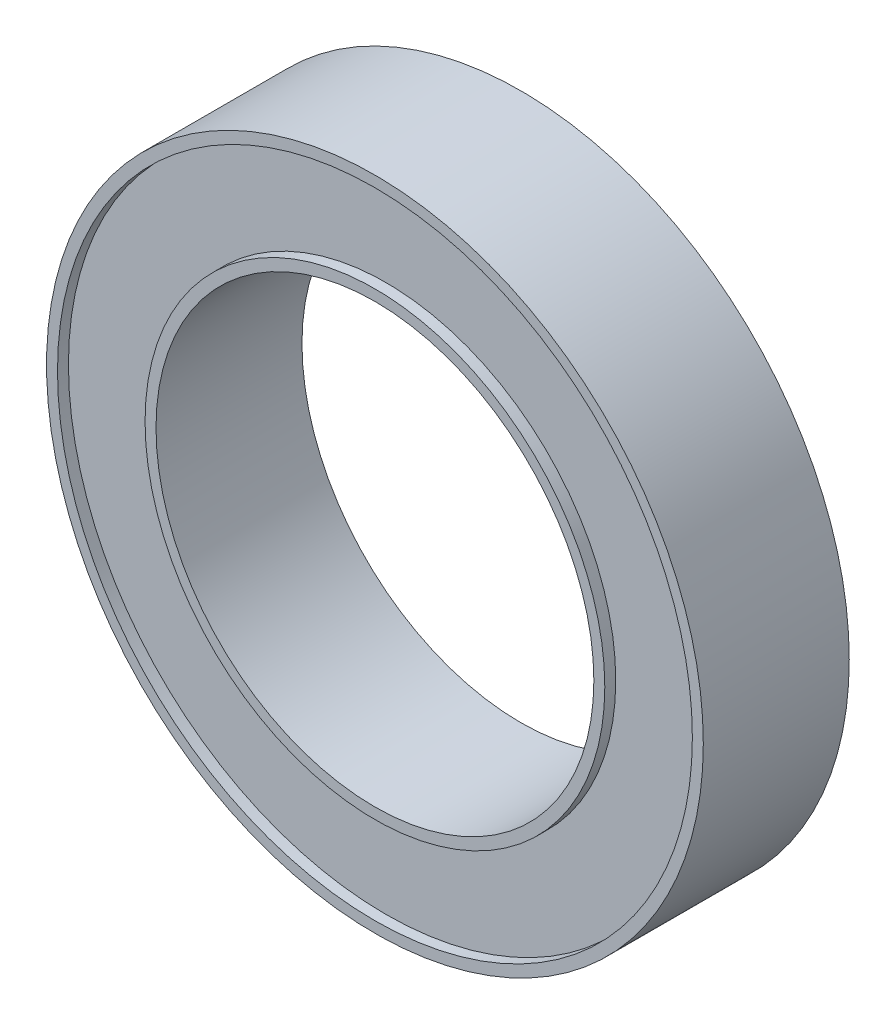
ISO-10303-21;
HEADER;
FILE_DESCRIPTION(('STEP AP214'),'2;1');
FILE_NAME('part.step','',(''),(''),'','','');
FILE_SCHEMA(('AUTOMOTIVE_DESIGN { 1 0 10303 214 1 1 1 1 }'));
ENDSEC;
DATA;
#1=APPLICATION_CONTEXT('core data for automotive mechanical design processes');
#2=APPLICATION_PROTOCOL_DEFINITION('international standard','automotive_design',2000,#1);
#3=PRODUCT_CONTEXT('',#1,'mechanical');
#4=PRODUCT('Part','Part','',(#3));
#5=PRODUCT_RELATED_PRODUCT_CATEGORY('part','',(#4));
#6=PRODUCT_DEFINITION_FORMATION('','',#4);
#7=PRODUCT_DEFINITION_CONTEXT('part definition',#1,'design');
#8=PRODUCT_DEFINITION('design','',#6,#7);
#9=PRODUCT_DEFINITION_SHAPE('','',#8);
#10=(LENGTH_UNIT() NAMED_UNIT(*) SI_UNIT(.MILLI.,.METRE.));
#11=(NAMED_UNIT(*) PLANE_ANGLE_UNIT() SI_UNIT($,.RADIAN.));
#12=(NAMED_UNIT(*) SI_UNIT($,.STERADIAN.) SOLID_ANGLE_UNIT());
#13=UNCERTAINTY_MEASURE_WITH_UNIT(LENGTH_MEASURE(1.E-05),#10,'distance_accuracy_value','');
#14=(GEOMETRIC_REPRESENTATION_CONTEXT(3) GLOBAL_UNCERTAINTY_ASSIGNED_CONTEXT((#13)) GLOBAL_UNIT_ASSIGNED_CONTEXT((#10,
#11,#12)) REPRESENTATION_CONTEXT('',''));
#15=CARTESIAN_POINT('',(0.,0.,0.));
#16=DIRECTION('',(0.,0.,1.));
#17=DIRECTION('',(1.,0.,0.));
#18=AXIS2_PLACEMENT_3D('',#15,#16,#17);
#19=CARTESIAN_POINT('',(0.,0.,-2.));
#20=DIRECTION('',(0.,0.,1.));
#21=DIRECTION('',(1.,0.,0.));
#22=AXIS2_PLACEMENT_3D('',#19,#20,#21);
#23=PLANE('',#22);
#24=CARTESIAN_POINT('',(0.,0.,-2.));
#25=DIRECTION('',(0.,0.,1.));
#26=DIRECTION('',(1.,0.,0.));
#27=AXIS2_PLACEMENT_3D('',#24,#25,#26);
#28=CIRCLE('',#27,6.);
#29=CARTESIAN_POINT('',(6.,0.,-2.));
#30=VERTEX_POINT('',#29);
#31=EDGE_CURVE('E45',#30,#30,#28,.T.);
#32=ORIENTED_EDGE('',*,*,#31,.T.);
#33=EDGE_LOOP('',(#32));
#34=FACE_BOUND('',#33,.T.);
#35=CARTESIAN_POINT('',(0.,0.,-2.));
#36=DIRECTION('',(0.,0.,1.));
#37=DIRECTION('',(1.,0.,0.));
#38=AXIS2_PLACEMENT_3D('',#35,#36,#37);
#39=CIRCLE('',#38,6.3);
#40=CARTESIAN_POINT('',(6.3,0.,-2.));
#41=VERTEX_POINT('',#40);
#42=EDGE_CURVE('E69',#41,#41,#39,.T.);
#43=ORIENTED_EDGE('',*,*,#42,.F.);
#44=EDGE_LOOP('',(#43));
#45=FACE_BOUND('',#44,.T.);
#46=ADVANCED_FACE('F32',(#34,#45),#23,.F.);
#47=CARTESIAN_POINT('',(0.,0.,2.));
#48=DIRECTION('',(0.,0.,1.));
#49=DIRECTION('',(1.,0.,0.));
#50=AXIS2_PLACEMENT_3D('',#47,#48,#49);
#51=PLANE('',#50);
#52=CARTESIAN_POINT('',(0.,0.,2.));
#53=DIRECTION('',(0.,0.,1.));
#54=DIRECTION('',(1.,0.,0.));
#55=AXIS2_PLACEMENT_3D('',#52,#53,#54);
#56=CIRCLE('',#55,6.);
#57=CARTESIAN_POINT('',(6.,0.,2.));
#58=VERTEX_POINT('',#57);
#59=EDGE_CURVE('E43',#58,#58,#56,.T.);
#60=ORIENTED_EDGE('',*,*,#59,.F.);
#61=EDGE_LOOP('',(#60));
#62=FACE_BOUND('',#61,.T.);
#63=CARTESIAN_POINT('',(0.,0.,2.));
#64=DIRECTION('',(0.,0.,1.));
#65=DIRECTION('',(1.,0.,0.));
#66=AXIS2_PLACEMENT_3D('',#63,#64,#65);
#67=CIRCLE('',#66,6.3);
#68=CARTESIAN_POINT('',(6.3,0.,2.));
#69=VERTEX_POINT('',#68);
#70=EDGE_CURVE('E57',#69,#69,#67,.T.);
#71=ORIENTED_EDGE('',*,*,#70,.T.);
#72=EDGE_LOOP('',(#71));
#73=FACE_BOUND('',#72,.T.);
#74=ADVANCED_FACE('F85',(#62,#73),#51,.T.);
#75=CARTESIAN_POINT('',(0.,0.,2.));
#76=DIRECTION('',(0.,0.,1.));
#77=DIRECTION('',(1.,0.,0.));
#78=AXIS2_PLACEMENT_3D('',#75,#76,#77);
#79=CIRCLE('',#78,8.7);
#80=CARTESIAN_POINT('',(8.7,0.,2.));
#81=VERTEX_POINT('',#80);
#82=EDGE_CURVE('E51',#81,#81,#79,.T.);
#83=ORIENTED_EDGE('',*,*,#82,.F.);
#84=EDGE_LOOP('',(#83));
#85=FACE_BOUND('',#84,.T.);
#86=CARTESIAN_POINT('',(0.,0.,2.));
#87=DIRECTION('',(0.,0.,1.));
#88=DIRECTION('',(1.,0.,0.));
#89=AXIS2_PLACEMENT_3D('',#86,#87,#88);
#90=CIRCLE('',#89,9.);
#91=CARTESIAN_POINT('',(9.,0.,2.));
#92=VERTEX_POINT('',#91);
#93=EDGE_CURVE('E10',#92,#92,#90,.T.);
#94=ORIENTED_EDGE('',*,*,#93,.T.);
#95=EDGE_LOOP('',(#94));
#96=FACE_BOUND('',#95,.T.);
#97=ADVANCED_FACE('F91',(#85,#96),#51,.T.);
#98=CARTESIAN_POINT('',(0.,0.,-2.));
#99=DIRECTION('',(0.,0.,1.));
#100=DIRECTION('',(1.,0.,0.));
#101=AXIS2_PLACEMENT_3D('',#98,#99,#100);
#102=CIRCLE('',#101,8.7);
#103=CARTESIAN_POINT('',(8.7,0.,-2.));
#104=VERTEX_POINT('',#103);
#105=EDGE_CURVE('E63',#104,#104,#102,.T.);
#106=ORIENTED_EDGE('',*,*,#105,.T.);
#107=EDGE_LOOP('',(#106));
#108=FACE_BOUND('',#107,.T.);
#109=CARTESIAN_POINT('',(0.,0.,-2.));
#110=DIRECTION('',(0.,0.,1.));
#111=DIRECTION('',(1.,0.,0.));
#112=AXIS2_PLACEMENT_3D('',#109,#110,#111);
#113=CIRCLE('',#112,9.);
#114=CARTESIAN_POINT('',(9.,0.,-2.));
#115=VERTEX_POINT('',#114);
#116=EDGE_CURVE('E36',#115,#115,#113,.T.);
#117=ORIENTED_EDGE('',*,*,#116,.F.);
#118=EDGE_LOOP('',(#117));
#119=FACE_BOUND('',#118,.T.);
#120=ADVANCED_FACE('F87',(#108,#119),#23,.F.);
#121=CARTESIAN_POINT('',(0.,0.,2.));
#122=DIRECTION('',(0.,0.,-1.));
#123=DIRECTION('',(-1.,0.,0.));
#124=AXIS2_PLACEMENT_3D('',#121,#122,#123);
#125=CYLINDRICAL_SURFACE('',#124,9.);
#126=ORIENTED_EDGE('',*,*,#93,.F.);
#127=EDGE_LOOP('',(#126));
#128=FACE_BOUND('',#127,.T.);
#129=ORIENTED_EDGE('',*,*,#116,.T.);
#130=EDGE_LOOP('',(#129));
#131=FACE_BOUND('',#130,.T.);
#132=ADVANCED_FACE('F34',(#128,#131),#125,.T.);
#133=CARTESIAN_POINT('',(0.,0.,2.));
#134=DIRECTION('',(0.,0.,-1.));
#135=DIRECTION('',(-1.,0.,0.));
#136=AXIS2_PLACEMENT_3D('',#133,#134,#135);
#137=CYLINDRICAL_SURFACE('',#136,6.);
#138=ORIENTED_EDGE('',*,*,#59,.T.);
#139=EDGE_LOOP('',(#138));
#140=FACE_BOUND('',#139,.T.);
#141=ORIENTED_EDGE('',*,*,#31,.F.);
#142=EDGE_LOOP('',(#141));
#143=FACE_BOUND('',#142,.T.);
#144=ADVANCED_FACE('F100',(#140,#143),#137,.F.);
#145=CARTESIAN_POINT('',(0.,0.,1.7));
#146=DIRECTION('',(0.,0.,1.));
#147=DIRECTION('',(1.,0.,0.));
#148=AXIS2_PLACEMENT_3D('',#145,#146,#147);
#149=CYLINDRICAL_SURFACE('',#148,8.7);
#150=CARTESIAN_POINT('',(0.,0.,1.7));
#151=DIRECTION('',(0.,0.,1.));
#152=DIRECTION('',(1.,0.,0.));
#153=AXIS2_PLACEMENT_3D('',#150,#151,#152);
#154=CIRCLE('',#153,8.7);
#155=CARTESIAN_POINT('',(8.7,0.,1.7));
#156=VERTEX_POINT('',#155);
#157=EDGE_CURVE('E48',#156,#156,#154,.T.);
#158=ORIENTED_EDGE('',*,*,#157,.F.);
#159=EDGE_LOOP('',(#158));
#160=FACE_BOUND('',#159,.T.);
#161=ORIENTED_EDGE('',*,*,#82,.T.);
#162=EDGE_LOOP('',(#161));
#163=FACE_BOUND('',#162,.T.);
#164=ADVANCED_FACE('F124',(#160,#163),#149,.F.);
#165=CARTESIAN_POINT('',(0.,0.,1.7));
#166=DIRECTION('',(0.,0.,1.));
#167=DIRECTION('',(1.,0.,0.));
#168=AXIS2_PLACEMENT_3D('',#165,#166,#167);
#169=PLANE('',#168);
#170=CARTESIAN_POINT('',(0.,0.,1.7));
#171=DIRECTION('',(0.,0.,1.));
#172=DIRECTION('',(1.,0.,0.));
#173=AXIS2_PLACEMENT_3D('',#170,#171,#172);
#174=CIRCLE('',#173,6.3);
#175=CARTESIAN_POINT('',(6.3,0.,1.7));
#176=VERTEX_POINT('',#175);
#177=EDGE_CURVE('E54',#176,#176,#174,.T.);
#178=ORIENTED_EDGE('',*,*,#177,.F.);
#179=EDGE_LOOP('',(#178));
#180=FACE_BOUND('',#179,.T.);
#181=ORIENTED_EDGE('',*,*,#157,.T.);
#182=EDGE_LOOP('',(#181));
#183=FACE_BOUND('',#182,.T.);
#184=ADVANCED_FACE('F120',(#180,#183),#169,.T.);
#185=CARTESIAN_POINT('',(0.,0.,1.7));
#186=DIRECTION('',(0.,0.,1.));
#187=DIRECTION('',(1.,0.,0.));
#188=AXIS2_PLACEMENT_3D('',#185,#186,#187);
#189=CYLINDRICAL_SURFACE('',#188,6.3);
#190=ORIENTED_EDGE('',*,*,#177,.T.);
#191=EDGE_LOOP('',(#190));
#192=FACE_BOUND('',#191,.T.);
#193=ORIENTED_EDGE('',*,*,#70,.F.);
#194=EDGE_LOOP('',(#193));
#195=FACE_BOUND('',#194,.T.);
#196=ADVANCED_FACE('F114',(#192,#195),#189,.T.);
#197=CARTESIAN_POINT('',(0.,0.,-1.7));
#198=DIRECTION('',(0.,0.,-1.));
#199=DIRECTION('',(1.,0.,0.));
#200=AXIS2_PLACEMENT_3D('',#197,#198,#199);
#201=PLANE('',#200);
#202=CARTESIAN_POINT('',(0.,0.,-1.7));
#203=DIRECTION('',(0.,0.,1.));
#204=DIRECTION('',(1.,0.,0.));
#205=AXIS2_PLACEMENT_3D('',#202,#203,#204);
#206=CIRCLE('',#205,8.7);
#207=CARTESIAN_POINT('',(8.7,0.,-1.7));
#208=VERTEX_POINT('',#207);
#209=EDGE_CURVE('E60',#208,#208,#206,.T.);
#210=ORIENTED_EDGE('',*,*,#209,.F.);
#211=EDGE_LOOP('',(#210));
#212=FACE_BOUND('',#211,.T.);
#213=CARTESIAN_POINT('',(0.,0.,-1.7));
#214=DIRECTION('',(0.,0.,1.));
#215=DIRECTION('',(1.,0.,0.));
#216=AXIS2_PLACEMENT_3D('',#213,#214,#215);
#217=CIRCLE('',#216,6.3);
#218=CARTESIAN_POINT('',(6.3,0.,-1.7));
#219=VERTEX_POINT('',#218);
#220=EDGE_CURVE('E66',#219,#219,#217,.T.);
#221=ORIENTED_EDGE('',*,*,#220,.T.);
#222=EDGE_LOOP('',(#221));
#223=FACE_BOUND('',#222,.T.);
#224=ADVANCED_FACE('F75',(#212,#223),#201,.T.);
#225=CARTESIAN_POINT('',(0.,0.,-1.7));
#226=DIRECTION('',(0.,0.,-1.));
#227=DIRECTION('',(-1.,0.,0.));
#228=AXIS2_PLACEMENT_3D('',#225,#226,#227);
#229=CYLINDRICAL_SURFACE('',#228,8.7);
#230=ORIENTED_EDGE('',*,*,#209,.T.);
#231=EDGE_LOOP('',(#230));
#232=FACE_BOUND('',#231,.T.);
#233=ORIENTED_EDGE('',*,*,#105,.F.);
#234=EDGE_LOOP('',(#233));
#235=FACE_BOUND('',#234,.T.);
#236=ADVANCED_FACE('F80',(#232,#235),#229,.F.);
#237=CARTESIAN_POINT('',(0.,0.,-1.7));
#238=DIRECTION('',(0.,0.,-1.));
#239=DIRECTION('',(-1.,0.,0.));
#240=AXIS2_PLACEMENT_3D('',#237,#238,#239);
#241=CYLINDRICAL_SURFACE('',#240,6.3);
#242=ORIENTED_EDGE('',*,*,#220,.F.);
#243=EDGE_LOOP('',(#242));
#244=FACE_BOUND('',#243,.T.);
#245=ORIENTED_EDGE('',*,*,#42,.T.);
#246=EDGE_LOOP('',(#245));
#247=FACE_BOUND('',#246,.T.);
#248=ADVANCED_FACE('F77',(#244,#247),#241,.T.);
#249=CLOSED_SHELL('',(#46,#74,#97,#120,#132,#144,#164,#184,#196,#224,#236,#248));
#250=MANIFOLD_SOLID_BREP('B2',#249);
#251=ADVANCED_BREP_SHAPE_REPRESENTATION('',(#18,#250),#14);
#252=SHAPE_DEFINITION_REPRESENTATION(#9,#251);
ENDSEC;
END-ISO-10303-21;
